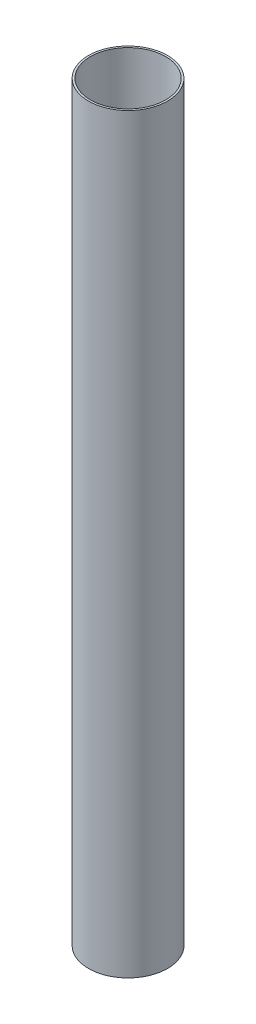
ISO-10303-21;
HEADER;
FILE_DESCRIPTION(('STEP AP214'),'2;1');
FILE_NAME('part.step','',(''),(''),'','','');
FILE_SCHEMA(('AUTOMOTIVE_DESIGN { 1 0 10303 214 1 1 1 1 }'));
ENDSEC;
DATA;
#1=APPLICATION_CONTEXT('core data for automotive mechanical design processes');
#2=APPLICATION_PROTOCOL_DEFINITION('international standard','automotive_design',2000,#1);
#3=PRODUCT_CONTEXT('',#1,'mechanical');
#4=PRODUCT('Part','Part','',(#3));
#5=PRODUCT_RELATED_PRODUCT_CATEGORY('part','',(#4));
#6=PRODUCT_DEFINITION_FORMATION('','',#4);
#7=PRODUCT_DEFINITION_CONTEXT('part definition',#1,'design');
#8=PRODUCT_DEFINITION('design','',#6,#7);
#9=PRODUCT_DEFINITION_SHAPE('','',#8);
#10=(LENGTH_UNIT() NAMED_UNIT(*) SI_UNIT(.MILLI.,.METRE.));
#11=(NAMED_UNIT(*) PLANE_ANGLE_UNIT() SI_UNIT($,.RADIAN.));
#12=(NAMED_UNIT(*) SI_UNIT($,.STERADIAN.) SOLID_ANGLE_UNIT());
#13=UNCERTAINTY_MEASURE_WITH_UNIT(LENGTH_MEASURE(1.E-05),#10,'distance_accuracy_value','');
#14=(GEOMETRIC_REPRESENTATION_CONTEXT(3) GLOBAL_UNCERTAINTY_ASSIGNED_CONTEXT((#13)) GLOBAL_UNIT_ASSIGNED_CONTEXT((#10,
#11,#12)) REPRESENTATION_CONTEXT('',''));
#15=CARTESIAN_POINT('',(0.,0.,0.));
#16=DIRECTION('',(0.,0.,1.));
#17=DIRECTION('',(1.,0.,0.));
#18=AXIS2_PLACEMENT_3D('',#15,#16,#17);
#19=CARTESIAN_POINT('',(0.,482.6,0.));
#20=DIRECTION('',(0.,1.,0.));
#21=DIRECTION('',(0.,0.,1.));
#22=AXIS2_PLACEMENT_3D('',#19,#20,#21);
#23=PLANE('',#22);
#24=CARTESIAN_POINT('',(0.,482.6,0.));
#25=DIRECTION('',(0.,1.,0.));
#26=DIRECTION('',(0.,0.,1.));
#27=AXIS2_PLACEMENT_3D('',#24,#25,#26);
#28=CIRCLE('',#27,25.4);
#29=CARTESIAN_POINT('',(0.,482.6,-25.4));
#30=VERTEX_POINT('',#29);
#31=EDGE_CURVE('E10',#30,#30,#28,.T.);
#32=ORIENTED_EDGE('',*,*,#31,.T.);
#33=EDGE_LOOP('',(#32));
#34=FACE_BOUND('',#33,.T.);
#35=CARTESIAN_POINT('',(0.,482.6,0.));
#36=DIRECTION('',(0.,1.,0.));
#37=DIRECTION('',(0.,0.,1.));
#38=AXIS2_PLACEMENT_3D('',#35,#36,#37);
#39=CIRCLE('',#38,24.1554);
#40=CARTESIAN_POINT('',(0.,482.6,-24.1554));
#41=VERTEX_POINT('',#40);
#42=EDGE_CURVE('E50',#41,#41,#39,.T.);
#43=ORIENTED_EDGE('',*,*,#42,.F.);
#44=EDGE_LOOP('',(#43));
#45=FACE_BOUND('',#44,.T.);
#46=ADVANCED_FACE('F37',(#34,#45),#23,.T.);
#47=CARTESIAN_POINT('',(0.,0.,0.));
#48=DIRECTION('',(0.,1.,0.));
#49=DIRECTION('',(0.,0.,1.));
#50=AXIS2_PLACEMENT_3D('',#47,#48,#49);
#51=PLANE('',#50);
#52=CARTESIAN_POINT('',(0.,0.,0.));
#53=DIRECTION('',(0.,1.,0.));
#54=DIRECTION('',(0.,0.,1.));
#55=AXIS2_PLACEMENT_3D('',#52,#53,#54);
#56=CIRCLE('',#55,25.4);
#57=CARTESIAN_POINT('',(0.,0.,-25.4));
#58=VERTEX_POINT('',#57);
#59=EDGE_CURVE('E41',#58,#58,#56,.T.);
#60=ORIENTED_EDGE('',*,*,#59,.F.);
#61=EDGE_LOOP('',(#60));
#62=FACE_BOUND('',#61,.T.);
#63=CARTESIAN_POINT('',(0.,0.,0.));
#64=DIRECTION('',(0.,1.,0.));
#65=DIRECTION('',(0.,0.,1.));
#66=AXIS2_PLACEMENT_3D('',#63,#64,#65);
#67=CIRCLE('',#66,24.1554);
#68=CARTESIAN_POINT('',(0.,0.,-24.1554));
#69=VERTEX_POINT('',#68);
#70=EDGE_CURVE('E52',#69,#69,#67,.T.);
#71=ORIENTED_EDGE('',*,*,#70,.T.);
#72=EDGE_LOOP('',(#71));
#73=FACE_BOUND('',#72,.T.);
#74=ADVANCED_FACE('F64',(#62,#73),#51,.F.);
#75=CARTESIAN_POINT('',(0.,482.6,0.));
#76=DIRECTION('',(0.,-1.,0.));
#77=DIRECTION('',(0.,0.,-1.));
#78=AXIS2_PLACEMENT_3D('',#75,#76,#77);
#79=CYLINDRICAL_SURFACE('',#78,25.4);
#80=CARTESIAN_POINT('',(0.,482.6,-25.4));
#81=CARTESIAN_POINT('',(0.,477.572916666667,-25.4));
#82=CARTESIAN_POINT('',(0.,472.545833333333,-25.4));
#83=CARTESIAN_POINT('',(0.,462.491666666667,-25.4));
#84=CARTESIAN_POINT('',(0.,457.464583333333,-25.4));
#85=CARTESIAN_POINT('',(0.,447.410416666667,-25.4));
#86=CARTESIAN_POINT('',(0.,442.383333333333,-25.4));
#87=CARTESIAN_POINT('',(0.,432.329166666667,-25.4));
#88=CARTESIAN_POINT('',(0.,427.302083333333,-25.4));
#89=CARTESIAN_POINT('',(0.,417.247916666667,-25.4));
#90=CARTESIAN_POINT('',(0.,412.220833333333,-25.4));
#91=CARTESIAN_POINT('',(0.,402.166666666667,-25.4));
#92=CARTESIAN_POINT('',(0.,397.139583333333,-25.4));
#93=CARTESIAN_POINT('',(0.,387.085416666667,-25.4));
#94=CARTESIAN_POINT('',(0.,382.058333333333,-25.4));
#95=CARTESIAN_POINT('',(0.,372.004166666667,-25.4));
#96=CARTESIAN_POINT('',(0.,366.977083333333,-25.4));
#97=CARTESIAN_POINT('',(0.,356.922916666667,-25.4));
#98=CARTESIAN_POINT('',(0.,351.895833333333,-25.4));
#99=CARTESIAN_POINT('',(0.,341.841666666667,-25.4));
#100=CARTESIAN_POINT('',(0.,336.814583333333,-25.4));
#101=CARTESIAN_POINT('',(0.,326.760416666667,-25.4));
#102=CARTESIAN_POINT('',(0.,321.733333333333,-25.4));
#103=CARTESIAN_POINT('',(0.,311.679166666667,-25.4));
#104=CARTESIAN_POINT('',(0.,306.652083333333,-25.4));
#105=CARTESIAN_POINT('',(0.,296.597916666667,-25.4));
#106=CARTESIAN_POINT('',(0.,291.570833333333,-25.4));
#107=CARTESIAN_POINT('',(0.,281.516666666667,-25.4));
#108=CARTESIAN_POINT('',(0.,276.489583333333,-25.4));
#109=CARTESIAN_POINT('',(0.,266.435416666667,-25.4));
#110=CARTESIAN_POINT('',(0.,261.408333333333,-25.4));
#111=CARTESIAN_POINT('',(0.,251.354166666667,-25.4));
#112=CARTESIAN_POINT('',(0.,246.327083333333,-25.4));
#113=CARTESIAN_POINT('',(0.,236.272916666667,-25.4));
#114=CARTESIAN_POINT('',(0.,231.245833333333,-25.4));
#115=CARTESIAN_POINT('',(0.,221.191666666667,-25.4));
#116=CARTESIAN_POINT('',(0.,216.164583333333,-25.4));
#117=CARTESIAN_POINT('',(0.,206.110416666667,-25.4));
#118=CARTESIAN_POINT('',(0.,201.083333333333,-25.4));
#119=CARTESIAN_POINT('',(0.,191.029166666667,-25.4));
#120=CARTESIAN_POINT('',(0.,186.002083333333,-25.4));
#121=CARTESIAN_POINT('',(0.,175.947916666667,-25.4));
#122=CARTESIAN_POINT('',(0.,170.920833333333,-25.4));
#123=CARTESIAN_POINT('',(0.,160.866666666667,-25.4));
#124=CARTESIAN_POINT('',(0.,155.839583333333,-25.4));
#125=CARTESIAN_POINT('',(0.,145.785416666667,-25.4));
#126=CARTESIAN_POINT('',(0.,140.758333333333,-25.4));
#127=CARTESIAN_POINT('',(0.,130.704166666667,-25.4));
#128=CARTESIAN_POINT('',(0.,125.677083333333,-25.4));
#129=CARTESIAN_POINT('',(0.,115.622916666667,-25.4));
#130=CARTESIAN_POINT('',(0.,110.595833333333,-25.4));
#131=CARTESIAN_POINT('',(0.,100.541666666667,-25.4));
#132=CARTESIAN_POINT('',(0.,95.5145833333333,-25.4));
#133=CARTESIAN_POINT('',(0.,85.4604166666667,-25.4));
#134=CARTESIAN_POINT('',(0.,80.4333333333333,-25.4));
#135=CARTESIAN_POINT('',(0.,70.3791666666667,-25.4));
#136=CARTESIAN_POINT('',(0.,65.3520833333334,-25.4));
#137=CARTESIAN_POINT('',(0.,55.2979166666667,-25.4));
#138=CARTESIAN_POINT('',(0.,50.2708333333333,-25.4));
#139=CARTESIAN_POINT('',(0.,40.2166666666666,-25.4));
#140=CARTESIAN_POINT('',(0.,35.1895833333333,-25.4));
#141=CARTESIAN_POINT('',(0.,25.1354166666667,-25.4));
#142=CARTESIAN_POINT('',(0.,20.1083333333333,-25.4));
#143=CARTESIAN_POINT('',(0.,10.0541666666667,-25.4));
#144=CARTESIAN_POINT('',(0.,5.02708333333333,-25.4));
#145=CARTESIAN_POINT('',(0.,0.,-25.4));
#146=B_SPLINE_CURVE_WITH_KNOTS('',3,(#80,#81,#82,#83,#84,#85,#86,#87,#88,#89,#90,#91,#92,#93,
#94,#95,#96,#97,#98,#99,#100,#101,#102,#103,#104,#105,#106,#107,#108,#109,#110,#111,#112,#113,
#114,#115,#116,#117,#118,#119,#120,#121,#122,#123,#124,#125,#126,#127,#128,#129,#130,#131,#132,
#133,#134,#135,#136,#137,#138,#139,#140,#141,#142,#143,#144,#145),.UNSPECIFIED.,.F.,.F.,(4,2,2,
2,2,2,2,2,2,2,2,2,2,2,2,2,2,2,2,2,2,2,2,2,2,2,2,2,2,2,2,2,4),(0.,15.08125,30.1625,45.24375,
60.325,75.40625,90.4874999999999,105.56875,120.65,135.73125,150.8125,165.89375,180.975,
196.05625,211.1375,226.21875,241.3,256.38125,271.4625,286.54375,301.625,316.70625,331.7875,
346.86875,361.95,377.03125,392.1125,407.19375,422.275,437.35625,452.4375,467.51875,482.6),.UNSPECIFIED.);
#147=EDGE_CURVE('BSEAM39',#30,#58,#146,.T.);
#148=ORIENTED_EDGE('',*,*,#31,.F.);
#149=ORIENTED_EDGE('',*,*,#59,.T.);
#150=ORIENTED_EDGE('',*,*,#147,.T.);
#151=ORIENTED_EDGE('',*,*,#147,.F.);
#152=EDGE_LOOP('',(#148,#150,#149,#151));
#153=FACE_BOUND('',#152,.T.);
#154=ADVANCED_FACE('F39',(#153),#79,.T.);
#155=CARTESIAN_POINT('',(0.,482.6,0.));
#156=DIRECTION('',(0.,-1.,0.));
#157=DIRECTION('',(0.,0.,-1.));
#158=AXIS2_PLACEMENT_3D('',#155,#156,#157);
#159=CYLINDRICAL_SURFACE('',#158,24.1554);
#160=CARTESIAN_POINT('',(0.,482.6,-24.1554));
#161=CARTESIAN_POINT('',(0.,477.572916666667,-24.1554));
#162=CARTESIAN_POINT('',(0.,472.545833333333,-24.1554));
#163=CARTESIAN_POINT('',(0.,462.491666666667,-24.1554));
#164=CARTESIAN_POINT('',(0.,457.464583333333,-24.1554));
#165=CARTESIAN_POINT('',(0.,447.410416666667,-24.1554));
#166=CARTESIAN_POINT('',(0.,442.383333333333,-24.1554));
#167=CARTESIAN_POINT('',(0.,432.329166666667,-24.1554));
#168=CARTESIAN_POINT('',(0.,427.302083333333,-24.1554));
#169=CARTESIAN_POINT('',(0.,417.247916666667,-24.1554));
#170=CARTESIAN_POINT('',(0.,412.220833333333,-24.1554));
#171=CARTESIAN_POINT('',(0.,402.166666666667,-24.1554));
#172=CARTESIAN_POINT('',(0.,397.139583333333,-24.1554));
#173=CARTESIAN_POINT('',(0.,387.085416666667,-24.1554));
#174=CARTESIAN_POINT('',(0.,382.058333333333,-24.1554));
#175=CARTESIAN_POINT('',(0.,372.004166666667,-24.1554));
#176=CARTESIAN_POINT('',(0.,366.977083333333,-24.1554));
#177=CARTESIAN_POINT('',(0.,356.922916666667,-24.1554));
#178=CARTESIAN_POINT('',(0.,351.895833333333,-24.1554));
#179=CARTESIAN_POINT('',(0.,341.841666666667,-24.1554));
#180=CARTESIAN_POINT('',(0.,336.814583333333,-24.1554));
#181=CARTESIAN_POINT('',(0.,326.760416666667,-24.1554));
#182=CARTESIAN_POINT('',(0.,321.733333333333,-24.1554));
#183=CARTESIAN_POINT('',(0.,311.679166666667,-24.1554));
#184=CARTESIAN_POINT('',(0.,306.652083333333,-24.1554));
#185=CARTESIAN_POINT('',(0.,296.597916666667,-24.1554));
#186=CARTESIAN_POINT('',(0.,291.570833333333,-24.1554));
#187=CARTESIAN_POINT('',(0.,281.516666666667,-24.1554));
#188=CARTESIAN_POINT('',(0.,276.489583333333,-24.1554));
#189=CARTESIAN_POINT('',(0.,266.435416666667,-24.1554));
#190=CARTESIAN_POINT('',(0.,261.408333333333,-24.1554));
#191=CARTESIAN_POINT('',(0.,251.354166666667,-24.1554));
#192=CARTESIAN_POINT('',(0.,246.327083333333,-24.1554));
#193=CARTESIAN_POINT('',(0.,236.272916666667,-24.1554));
#194=CARTESIAN_POINT('',(0.,231.245833333333,-24.1554));
#195=CARTESIAN_POINT('',(0.,221.191666666667,-24.1554));
#196=CARTESIAN_POINT('',(0.,216.164583333333,-24.1554));
#197=CARTESIAN_POINT('',(0.,206.110416666667,-24.1554));
#198=CARTESIAN_POINT('',(0.,201.083333333333,-24.1554));
#199=CARTESIAN_POINT('',(0.,191.029166666667,-24.1554));
#200=CARTESIAN_POINT('',(0.,186.002083333333,-24.1554));
#201=CARTESIAN_POINT('',(0.,175.947916666667,-24.1554));
#202=CARTESIAN_POINT('',(0.,170.920833333333,-24.1554));
#203=CARTESIAN_POINT('',(0.,160.866666666667,-24.1554));
#204=CARTESIAN_POINT('',(0.,155.839583333333,-24.1554));
#205=CARTESIAN_POINT('',(0.,145.785416666667,-24.1554));
#206=CARTESIAN_POINT('',(0.,140.758333333333,-24.1554));
#207=CARTESIAN_POINT('',(0.,130.704166666667,-24.1554));
#208=CARTESIAN_POINT('',(0.,125.677083333333,-24.1554));
#209=CARTESIAN_POINT('',(0.,115.622916666667,-24.1554));
#210=CARTESIAN_POINT('',(0.,110.595833333333,-24.1554));
#211=CARTESIAN_POINT('',(0.,100.541666666667,-24.1554));
#212=CARTESIAN_POINT('',(0.,95.5145833333333,-24.1554));
#213=CARTESIAN_POINT('',(0.,85.4604166666667,-24.1554));
#214=CARTESIAN_POINT('',(0.,80.4333333333333,-24.1554));
#215=CARTESIAN_POINT('',(0.,70.3791666666667,-24.1554));
#216=CARTESIAN_POINT('',(0.,65.3520833333334,-24.1554));
#217=CARTESIAN_POINT('',(0.,55.2979166666667,-24.1554));
#218=CARTESIAN_POINT('',(0.,50.2708333333334,-24.1554));
#219=CARTESIAN_POINT('',(0.,40.2166666666667,-24.1554));
#220=CARTESIAN_POINT('',(0.,35.1895833333333,-24.1554));
#221=CARTESIAN_POINT('',(0.,25.1354166666667,-24.1554));
#222=CARTESIAN_POINT('',(0.,20.1083333333333,-24.1554));
#223=CARTESIAN_POINT('',(0.,10.0541666666667,-24.1554));
#224=CARTESIAN_POINT('',(0.,5.02708333333333,-24.1554));
#225=CARTESIAN_POINT('',(0.,0.,-24.1554));
#226=B_SPLINE_CURVE_WITH_KNOTS('',3,(#160,#161,#162,#163,#164,#165,#166,#167,#168,#169,#170,
#171,#172,#173,#174,#175,#176,#177,#178,#179,#180,#181,#182,#183,#184,#185,#186,#187,#188,#189,
#190,#191,#192,#193,#194,#195,#196,#197,#198,#199,#200,#201,#202,#203,#204,#205,#206,#207,#208,
#209,#210,#211,#212,#213,#214,#215,#216,#217,#218,#219,#220,#221,#222,#223,#224,#225),
.UNSPECIFIED.,.F.,.F.,(4,2,2,2,2,2,2,2,2,2,2,2,2,2,2,2,2,2,2,2,2,2,2,2,2,2,2,2,2,2,2,2,4),(0.,
15.08125,30.1625,45.24375,60.325,75.40625,90.4875,105.56875,120.65,135.73125,150.8125,165.89375,
180.975,196.05625,211.1375,226.21875,241.3,256.38125,271.4625,286.54375,301.625,316.70625,
331.7875,346.86875,361.95,377.03125,392.1125,407.19375,422.275,437.35625,452.4375,467.51875,
482.6),.UNSPECIFIED.);
#227=EDGE_CURVE('BSEAM60',#41,#69,#226,.T.);
#228=ORIENTED_EDGE('',*,*,#42,.T.);
#229=ORIENTED_EDGE('',*,*,#70,.F.);
#230=ORIENTED_EDGE('',*,*,#227,.T.);
#231=ORIENTED_EDGE('',*,*,#227,.F.);
#232=EDGE_LOOP('',(#228,#230,#229,#231));
#233=FACE_BOUND('',#232,.T.);
#234=ADVANCED_FACE('F60',(#233),#159,.F.);
#235=CLOSED_SHELL('',(#46,#74,#154,#234));
#236=MANIFOLD_SOLID_BREP('B2',#235);
#237=ADVANCED_BREP_SHAPE_REPRESENTATION('',(#18,#236),#14);
#238=SHAPE_DEFINITION_REPRESENTATION(#9,#237);
ENDSEC;
END-ISO-10303-21;
